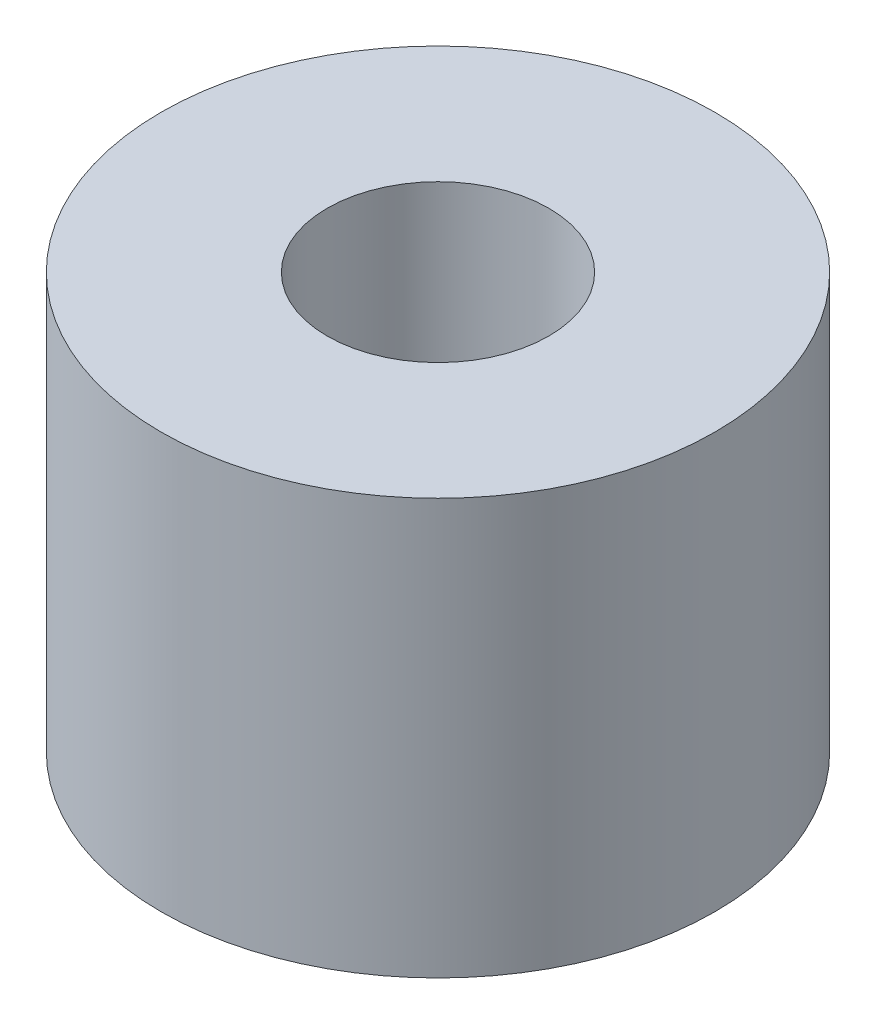
ISO-10303-21;
HEADER;
FILE_DESCRIPTION(('STEP AP214'),'2;1');
FILE_NAME('part.step','',(''),(''),'','','');
FILE_SCHEMA(('AUTOMOTIVE_DESIGN { 1 0 10303 214 1 1 1 1 }'));
ENDSEC;
DATA;
#1=APPLICATION_CONTEXT('core data for automotive mechanical design processes');
#2=APPLICATION_PROTOCOL_DEFINITION('international standard','automotive_design',2000,#1);
#3=PRODUCT_CONTEXT('',#1,'mechanical');
#4=PRODUCT('Part','Part','',(#3));
#5=PRODUCT_RELATED_PRODUCT_CATEGORY('part','',(#4));
#6=PRODUCT_DEFINITION_FORMATION('','',#4);
#7=PRODUCT_DEFINITION_CONTEXT('part definition',#1,'design');
#8=PRODUCT_DEFINITION('design','',#6,#7);
#9=PRODUCT_DEFINITION_SHAPE('','',#8);
#10=(LENGTH_UNIT() NAMED_UNIT(*) SI_UNIT(.MILLI.,.METRE.));
#11=(NAMED_UNIT(*) PLANE_ANGLE_UNIT() SI_UNIT($,.RADIAN.));
#12=(NAMED_UNIT(*) SI_UNIT($,.STERADIAN.) SOLID_ANGLE_UNIT());
#13=UNCERTAINTY_MEASURE_WITH_UNIT(LENGTH_MEASURE(1.E-05),#10,'distance_accuracy_value','');
#14=(GEOMETRIC_REPRESENTATION_CONTEXT(3) GLOBAL_UNCERTAINTY_ASSIGNED_CONTEXT((#13)) GLOBAL_UNIT_ASSIGNED_CONTEXT((#10,
#11,#12)) REPRESENTATION_CONTEXT('',''));
#15=CARTESIAN_POINT('',(0.,0.,0.));
#16=DIRECTION('',(0.,0.,1.));
#17=DIRECTION('',(1.,0.,0.));
#18=AXIS2_PLACEMENT_3D('',#15,#16,#17);
#19=CARTESIAN_POINT('',(0.,15.,0.));
#20=DIRECTION('',(0.,-1.,0.));
#21=DIRECTION('',(0.,0.,-1.));
#22=AXIS2_PLACEMENT_3D('',#19,#20,#21);
#23=CYLINDRICAL_SURFACE('',#22,10.);
#24=CARTESIAN_POINT('',(0.,15.,0.));
#25=DIRECTION('',(0.,1.,0.));
#26=DIRECTION('',(0.,0.,1.));
#27=AXIS2_PLACEMENT_3D('',#24,#25,#26);
#28=CIRCLE('',#27,10.);
#29=CARTESIAN_POINT('',(0.,15.,10.));
#30=VERTEX_POINT('',#29);
#31=EDGE_CURVE('E10',#30,#30,#28,.T.);
#32=ORIENTED_EDGE('',*,*,#31,.F.);
#33=EDGE_LOOP('',(#32));
#34=FACE_BOUND('',#33,.T.);
#35=CARTESIAN_POINT('',(0.,0.,0.));
#36=DIRECTION('',(0.,1.,0.));
#37=DIRECTION('',(0.,0.,1.));
#38=AXIS2_PLACEMENT_3D('',#35,#36,#37);
#39=CIRCLE('',#38,10.);
#40=CARTESIAN_POINT('',(0.,0.,10.));
#41=VERTEX_POINT('',#40);
#42=EDGE_CURVE('E44',#41,#41,#39,.T.);
#43=ORIENTED_EDGE('',*,*,#42,.T.);
#44=EDGE_LOOP('',(#43));
#45=FACE_BOUND('',#44,.T.);
#46=ADVANCED_FACE('F41',(#34,#45),#23,.T.);
#47=CARTESIAN_POINT('',(0.,15.,0.));
#48=DIRECTION('',(0.,1.,0.));
#49=DIRECTION('',(0.,0.,1.));
#50=AXIS2_PLACEMENT_3D('',#47,#48,#49);
#51=PLANE('',#50);
#52=CARTESIAN_POINT('',(0.,15.,0.));
#53=DIRECTION('',(0.,1.,0.));
#54=DIRECTION('',(0.,0.,1.));
#55=AXIS2_PLACEMENT_3D('',#52,#53,#54);
#56=CIRCLE('',#55,4.);
#57=CARTESIAN_POINT('',(0.,15.,4.));
#58=VERTEX_POINT('',#57);
#59=EDGE_CURVE('E51',#58,#58,#56,.T.);
#60=ORIENTED_EDGE('',*,*,#59,.F.);
#61=EDGE_LOOP('',(#60));
#62=FACE_BOUND('',#61,.T.);
#63=ORIENTED_EDGE('',*,*,#31,.T.);
#64=EDGE_LOOP('',(#63));
#65=FACE_BOUND('',#64,.T.);
#66=ADVANCED_FACE('F62',(#62,#65),#51,.T.);
#67=CARTESIAN_POINT('',(0.,0.,0.));
#68=DIRECTION('',(0.,1.,0.));
#69=DIRECTION('',(0.,0.,1.));
#70=AXIS2_PLACEMENT_3D('',#67,#68,#69);
#71=PLANE('',#70);
#72=CARTESIAN_POINT('',(0.,0.,0.));
#73=DIRECTION('',(0.,1.,0.));
#74=DIRECTION('',(0.,0.,1.));
#75=AXIS2_PLACEMENT_3D('',#72,#73,#74);
#76=CIRCLE('',#75,4.);
#77=CARTESIAN_POINT('',(0.,0.,4.));
#78=VERTEX_POINT('',#77);
#79=EDGE_CURVE('E53',#78,#78,#76,.T.);
#80=ORIENTED_EDGE('',*,*,#79,.T.);
#81=EDGE_LOOP('',(#80));
#82=FACE_BOUND('',#81,.T.);
#83=ORIENTED_EDGE('',*,*,#42,.F.);
#84=EDGE_LOOP('',(#83));
#85=FACE_BOUND('',#84,.T.);
#86=ADVANCED_FACE('F64',(#82,#85),#71,.F.);
#87=CARTESIAN_POINT('',(0.,15.,0.));
#88=DIRECTION('',(0.,-1.,0.));
#89=DIRECTION('',(0.,0.,-1.));
#90=AXIS2_PLACEMENT_3D('',#87,#88,#89);
#91=CYLINDRICAL_SURFACE('',#90,4.);
#92=ORIENTED_EDGE('',*,*,#59,.T.);
#93=EDGE_LOOP('',(#92));
#94=FACE_BOUND('',#93,.T.);
#95=ORIENTED_EDGE('',*,*,#79,.F.);
#96=EDGE_LOOP('',(#95));
#97=FACE_BOUND('',#96,.T.);
#98=ADVANCED_FACE('F59',(#94,#97),#91,.F.);
#99=CLOSED_SHELL('',(#46,#66,#86,#98));
#100=MANIFOLD_SOLID_BREP('B2',#99);
#101=ADVANCED_BREP_SHAPE_REPRESENTATION('',(#18,#100),#14);
#102=SHAPE_DEFINITION_REPRESENTATION(#9,#101);
ENDSEC;
END-ISO-10303-21;
